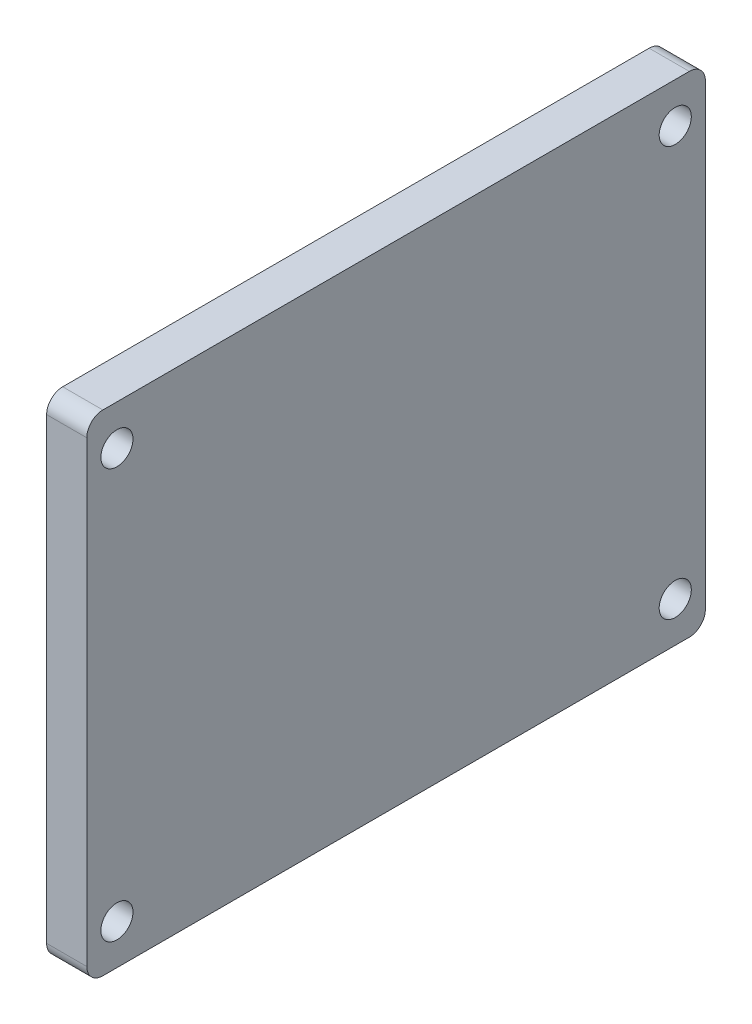
ISO-10303-21;
HEADER;
FILE_DESCRIPTION(('STEP AP214'),'2;1');
FILE_NAME('part.step','',(''),(''),'','','');
FILE_SCHEMA(('AUTOMOTIVE_DESIGN { 1 0 10303 214 1 1 1 1 }'));
ENDSEC;
DATA;
#1=APPLICATION_CONTEXT('core data for automotive mechanical design processes');
#2=APPLICATION_PROTOCOL_DEFINITION('international standard','automotive_design',2000,#1);
#3=PRODUCT_CONTEXT('',#1,'mechanical');
#4=PRODUCT('Part','Part','',(#3));
#5=PRODUCT_RELATED_PRODUCT_CATEGORY('part','',(#4));
#6=PRODUCT_DEFINITION_FORMATION('','',#4);
#7=PRODUCT_DEFINITION_CONTEXT('part definition',#1,'design');
#8=PRODUCT_DEFINITION('design','',#6,#7);
#9=PRODUCT_DEFINITION_SHAPE('','',#8);
#10=(LENGTH_UNIT() NAMED_UNIT(*) SI_UNIT(.MILLI.,.METRE.));
#11=(NAMED_UNIT(*) PLANE_ANGLE_UNIT() SI_UNIT($,.RADIAN.));
#12=(NAMED_UNIT(*) SI_UNIT($,.STERADIAN.) SOLID_ANGLE_UNIT());
#13=UNCERTAINTY_MEASURE_WITH_UNIT(LENGTH_MEASURE(1.E-05),#10,'distance_accuracy_value','');
#14=(GEOMETRIC_REPRESENTATION_CONTEXT(3) GLOBAL_UNCERTAINTY_ASSIGNED_CONTEXT((#13)) GLOBAL_UNIT_ASSIGNED_CONTEXT((#10,
#11,#12)) REPRESENTATION_CONTEXT('',''));
#15=CARTESIAN_POINT('',(0.,0.,0.));
#16=DIRECTION('',(0.,0.,1.));
#17=DIRECTION('',(1.,0.,0.));
#18=AXIS2_PLACEMENT_3D('',#15,#16,#17);
#19=CARTESIAN_POINT('',(5.,30.5,-38.5));
#20=DIRECTION('',(0.,0.,1.));
#21=DIRECTION('',(0.,-1.,0.));
#22=AXIS2_PLACEMENT_3D('',#19,#20,#21);
#23=PLANE('',#22);
#24=DIRECTION('',(0.,1.,0.));
#25=VECTOR('',#24,1.);
#26=CARTESIAN_POINT('',(5.,30.5,-38.5));
#27=LINE('',#26,#25);
#28=CARTESIAN_POINT('',(5.,-28.5,-38.5));
#29=VERTEX_POINT('',#28);
#30=CARTESIAN_POINT('',(5.,28.5,-38.5));
#31=VERTEX_POINT('',#30);
#32=EDGE_CURVE('E129',#29,#31,#27,.T.);
#33=ORIENTED_EDGE('',*,*,#32,.F.);
#34=DIRECTION('',(-1.,0.,0.));
#35=VECTOR('',#34,1.);
#36=CARTESIAN_POINT('',(5.,-28.5,-38.5));
#37=LINE('',#36,#35);
#38=CARTESIAN_POINT('',(0.,-28.5,-38.5));
#39=VERTEX_POINT('',#38);
#40=EDGE_CURVE('E11',#29,#39,#37,.T.);
#41=ORIENTED_EDGE('',*,*,#40,.T.);
#42=DIRECTION('',(0.,1.,0.));
#43=VECTOR('',#42,1.);
#44=CARTESIAN_POINT('',(0.,30.5,-38.5));
#45=LINE('',#44,#43);
#46=CARTESIAN_POINT('',(0.,28.5,-38.5));
#47=VERTEX_POINT('',#46);
#48=EDGE_CURVE('E131',#39,#47,#45,.T.);
#49=ORIENTED_EDGE('',*,*,#48,.T.);
#50=DIRECTION('',(-1.,0.,0.));
#51=VECTOR('',#50,1.);
#52=CARTESIAN_POINT('',(5.,28.5,-38.5));
#53=LINE('',#52,#51);
#54=EDGE_CURVE('E144',#47,#31,#53,.F.);
#55=ORIENTED_EDGE('',*,*,#54,.T.);
#56=EDGE_LOOP('',(#33,#41,#49,#55));
#57=FACE_BOUND('',#56,.T.);
#58=ADVANCED_FACE('F37',(#57),#23,.F.);
#59=CARTESIAN_POINT('',(5.,30.5,38.5));
#60=DIRECTION('',(0.,-1.,0.));
#61=DIRECTION('',(0.,0.,-1.));
#62=AXIS2_PLACEMENT_3D('',#59,#60,#61);
#63=PLANE('',#62);
#64=DIRECTION('',(0.,0.,1.));
#65=VECTOR('',#64,1.);
#66=CARTESIAN_POINT('',(5.,30.5,38.5));
#67=LINE('',#66,#65);
#68=CARTESIAN_POINT('',(5.,30.5,-36.5));
#69=VERTEX_POINT('',#68);
#70=CARTESIAN_POINT('',(5.,30.5,36.5));
#71=VERTEX_POINT('',#70);
#72=EDGE_CURVE('E326',#69,#71,#67,.T.);
#73=ORIENTED_EDGE('',*,*,#72,.F.);
#74=DIRECTION('',(-1.,0.,0.));
#75=VECTOR('',#74,1.);
#76=CARTESIAN_POINT('',(5.,30.5,-36.5));
#77=LINE('',#76,#75);
#78=CARTESIAN_POINT('',(0.,30.5,-36.5));
#79=VERTEX_POINT('',#78);
#80=EDGE_CURVE('E138',#69,#79,#77,.T.);
#81=ORIENTED_EDGE('',*,*,#80,.T.);
#82=DIRECTION('',(0.,0.,1.));
#83=VECTOR('',#82,1.);
#84=CARTESIAN_POINT('',(0.,30.5,38.5));
#85=LINE('',#84,#83);
#86=CARTESIAN_POINT('',(0.,30.5,36.5));
#87=VERTEX_POINT('',#86);
#88=EDGE_CURVE('E126',#79,#87,#85,.T.);
#89=ORIENTED_EDGE('',*,*,#88,.T.);
#90=DIRECTION('',(-1.,0.,0.));
#91=VECTOR('',#90,1.);
#92=CARTESIAN_POINT('',(5.,30.5,36.5));
#93=LINE('',#92,#91);
#94=EDGE_CURVE('E112',#87,#71,#93,.F.);
#95=ORIENTED_EDGE('',*,*,#94,.T.);
#96=EDGE_LOOP('',(#73,#81,#89,#95));
#97=FACE_BOUND('',#96,.T.);
#98=ADVANCED_FACE('F178',(#97),#63,.F.);
#99=CARTESIAN_POINT('',(5.,30.5,38.5));
#100=DIRECTION('',(0.,0.,-1.));
#101=DIRECTION('',(0.,1.,0.));
#102=AXIS2_PLACEMENT_3D('',#99,#100,#101);
#103=PLANE('',#102);
#104=DIRECTION('',(0.,-1.,0.));
#105=VECTOR('',#104,1.);
#106=CARTESIAN_POINT('',(0.,30.5,38.5));
#107=LINE('',#106,#105);
#108=CARTESIAN_POINT('',(0.,28.5,38.5));
#109=VERTEX_POINT('',#108);
#110=CARTESIAN_POINT('',(0.,-28.5,38.5));
#111=VERTEX_POINT('',#110);
#112=EDGE_CURVE('E118',#109,#111,#107,.T.);
#113=ORIENTED_EDGE('',*,*,#112,.T.);
#114=DIRECTION('',(-1.,0.,0.));
#115=VECTOR('',#114,1.);
#116=CARTESIAN_POINT('',(5.,-28.5,38.5));
#117=LINE('',#116,#115);
#118=CARTESIAN_POINT('',(5.,-28.5,38.5));
#119=VERTEX_POINT('',#118);
#120=EDGE_CURVE('E60',#111,#119,#117,.F.);
#121=ORIENTED_EDGE('',*,*,#120,.T.);
#122=DIRECTION('',(0.,-1.,0.));
#123=VECTOR('',#122,1.);
#124=CARTESIAN_POINT('',(5.,30.5,38.5));
#125=LINE('',#124,#123);
#126=CARTESIAN_POINT('',(5.,28.5,38.5));
#127=VERTEX_POINT('',#126);
#128=EDGE_CURVE('E119',#127,#119,#125,.T.);
#129=ORIENTED_EDGE('',*,*,#128,.F.);
#130=DIRECTION('',(-1.,0.,0.));
#131=VECTOR('',#130,1.);
#132=CARTESIAN_POINT('',(5.,28.5,38.5));
#133=LINE('',#132,#131);
#134=EDGE_CURVE('E110',#127,#109,#133,.T.);
#135=ORIENTED_EDGE('',*,*,#134,.T.);
#136=EDGE_LOOP('',(#113,#121,#129,#135));
#137=FACE_BOUND('',#136,.T.);
#138=ADVANCED_FACE('F117',(#137),#103,.F.);
#139=CARTESIAN_POINT('',(5.,-30.5,38.5));
#140=DIRECTION('',(0.,1.,0.));
#141=DIRECTION('',(0.,0.,1.));
#142=AXIS2_PLACEMENT_3D('',#139,#140,#141);
#143=PLANE('',#142);
#144=DIRECTION('',(0.,0.,-1.));
#145=VECTOR('',#144,1.);
#146=CARTESIAN_POINT('',(5.,-30.5,38.5));
#147=LINE('',#146,#145);
#148=CARTESIAN_POINT('',(5.,-30.5,36.5));
#149=VERTEX_POINT('',#148);
#150=CARTESIAN_POINT('',(5.,-30.5,-36.5));
#151=VERTEX_POINT('',#150);
#152=EDGE_CURVE('E120',#149,#151,#147,.T.);
#153=ORIENTED_EDGE('',*,*,#152,.F.);
#154=DIRECTION('',(-1.,0.,0.));
#155=VECTOR('',#154,1.);
#156=CARTESIAN_POINT('',(5.,-30.5,36.5));
#157=LINE('',#156,#155);
#158=CARTESIAN_POINT('',(0.,-30.5,36.5));
#159=VERTEX_POINT('',#158);
#160=EDGE_CURVE('E151',#149,#159,#157,.T.);
#161=ORIENTED_EDGE('',*,*,#160,.T.);
#162=DIRECTION('',(0.,0.,-1.));
#163=VECTOR('',#162,1.);
#164=CARTESIAN_POINT('',(0.,-30.5,38.5));
#165=LINE('',#164,#163);
#166=CARTESIAN_POINT('',(0.,-30.5,-36.5));
#167=VERTEX_POINT('',#166);
#168=EDGE_CURVE('E125',#159,#167,#165,.T.);
#169=ORIENTED_EDGE('',*,*,#168,.T.);
#170=DIRECTION('',(-1.,0.,0.));
#171=VECTOR('',#170,1.);
#172=CARTESIAN_POINT('',(5.,-30.5,-36.5));
#173=LINE('',#172,#171);
#174=EDGE_CURVE('E149',#167,#151,#173,.F.);
#175=ORIENTED_EDGE('',*,*,#174,.T.);
#176=EDGE_LOOP('',(#153,#161,#169,#175));
#177=FACE_BOUND('',#176,.T.);
#178=ADVANCED_FACE('F164',(#177),#143,.F.);
#179=CARTESIAN_POINT('',(5.,0.,0.));
#180=DIRECTION('',(1.,0.,0.));
#181=DIRECTION('',(0.,0.,-1.));
#182=AXIS2_PLACEMENT_3D('',#179,#180,#181);
#183=PLANE('',#182);
#184=CARTESIAN_POINT('',(5.,-25.5,34.75));
#185=DIRECTION('',(1.,0.,0.));
#186=DIRECTION('',(0.,0.,-1.));
#187=AXIS2_PLACEMENT_3D('',#184,#185,#186);
#188=CIRCLE('',#187,2.);
#189=CARTESIAN_POINT('',(5.,-25.5,32.75));
#190=VERTEX_POINT('',#189);
#191=EDGE_CURVE('E312',#190,#190,#188,.T.);
#192=ORIENTED_EDGE('',*,*,#191,.F.);
#193=EDGE_LOOP('',(#192));
#194=FACE_BOUND('',#193,.T.);
#195=CARTESIAN_POINT('',(5.,25.5,-34.75));
#196=DIRECTION('',(1.,0.,0.));
#197=DIRECTION('',(0.,0.,-1.));
#198=AXIS2_PLACEMENT_3D('',#195,#196,#197);
#199=CIRCLE('',#198,2.);
#200=CARTESIAN_POINT('',(5.,25.5,-36.75));
#201=VERTEX_POINT('',#200);
#202=EDGE_CURVE('E305',#201,#201,#199,.T.);
#203=ORIENTED_EDGE('',*,*,#202,.F.);
#204=EDGE_LOOP('',(#203));
#205=FACE_BOUND('',#204,.T.);
#206=CARTESIAN_POINT('',(5.,-25.5,-34.75));
#207=DIRECTION('',(1.,0.,0.));
#208=DIRECTION('',(0.,0.,-1.));
#209=AXIS2_PLACEMENT_3D('',#206,#207,#208);
#210=CIRCLE('',#209,2.);
#211=CARTESIAN_POINT('',(5.,-25.5,-36.75));
#212=VERTEX_POINT('',#211);
#213=EDGE_CURVE('E302',#212,#212,#210,.T.);
#214=ORIENTED_EDGE('',*,*,#213,.F.);
#215=EDGE_LOOP('',(#214));
#216=FACE_BOUND('',#215,.T.);
#217=CARTESIAN_POINT('',(5.,25.5,34.75));
#218=DIRECTION('',(1.,0.,0.));
#219=DIRECTION('',(0.,0.,-1.));
#220=AXIS2_PLACEMENT_3D('',#217,#218,#219);
#221=CIRCLE('',#220,2.);
#222=CARTESIAN_POINT('',(5.,25.5,32.75));
#223=VERTEX_POINT('',#222);
#224=EDGE_CURVE('E311',#223,#223,#221,.T.);
#225=ORIENTED_EDGE('',*,*,#224,.F.);
#226=EDGE_LOOP('',(#225));
#227=FACE_BOUND('',#226,.T.);
#228=ORIENTED_EDGE('',*,*,#128,.T.);
#229=CARTESIAN_POINT('',(5.,-28.5,36.5));
#230=DIRECTION('',(1.,0.,0.));
#231=DIRECTION('',(0.,0.,-1.));
#232=AXIS2_PLACEMENT_3D('',#229,#230,#231);
#233=CIRCLE('',#232,2.);
#234=EDGE_CURVE('E45',#119,#149,#233,.T.);
#235=ORIENTED_EDGE('',*,*,#234,.T.);
#236=ORIENTED_EDGE('',*,*,#152,.T.);
#237=CARTESIAN_POINT('',(5.,-28.5,-36.5));
#238=DIRECTION('',(1.,0.,0.));
#239=DIRECTION('',(0.,0.,-1.));
#240=AXIS2_PLACEMENT_3D('',#237,#238,#239);
#241=CIRCLE('',#240,2.);
#242=EDGE_CURVE('E52',#151,#29,#241,.T.);
#243=ORIENTED_EDGE('',*,*,#242,.T.);
#244=ORIENTED_EDGE('',*,*,#32,.T.);
#245=CARTESIAN_POINT('',(5.,28.5,-36.5));
#246=DIRECTION('',(1.,0.,0.));
#247=DIRECTION('',(0.,0.,-1.));
#248=AXIS2_PLACEMENT_3D('',#245,#246,#247);
#249=CIRCLE('',#248,2.);
#250=EDGE_CURVE('E147',#31,#69,#249,.T.);
#251=ORIENTED_EDGE('',*,*,#250,.T.);
#252=ORIENTED_EDGE('',*,*,#72,.T.);
#253=CARTESIAN_POINT('',(5.,28.5,36.5));
#254=DIRECTION('',(1.,0.,0.));
#255=DIRECTION('',(0.,0.,-1.));
#256=AXIS2_PLACEMENT_3D('',#253,#254,#255);
#257=CIRCLE('',#256,2.);
#258=EDGE_CURVE('E136',#71,#127,#257,.T.);
#259=ORIENTED_EDGE('',*,*,#258,.T.);
#260=EDGE_LOOP('',(#228,#235,#236,#243,#244,#251,#252,#259));
#261=FACE_BOUND('',#260,.T.);
#262=ADVANCED_FACE('F160',(#194,#205,#216,#227,#261),#183,.T.);
#263=CARTESIAN_POINT('',(0.,0.,0.));
#264=DIRECTION('',(1.,0.,0.));
#265=DIRECTION('',(0.,0.,-1.));
#266=AXIS2_PLACEMENT_3D('',#263,#264,#265);
#267=PLANE('',#266);
#268=CARTESIAN_POINT('',(0.,-25.5,34.75));
#269=DIRECTION('',(1.,0.,0.));
#270=DIRECTION('',(0.,0.,-1.));
#271=AXIS2_PLACEMENT_3D('',#268,#269,#270);
#272=CIRCLE('',#271,2.);
#273=CARTESIAN_POINT('',(0.,-25.5,32.75));
#274=VERTEX_POINT('',#273);
#275=EDGE_CURVE('E308',#274,#274,#272,.T.);
#276=ORIENTED_EDGE('',*,*,#275,.T.);
#277=EDGE_LOOP('',(#276));
#278=FACE_BOUND('',#277,.T.);
#279=CARTESIAN_POINT('',(0.,25.5,-34.75));
#280=DIRECTION('',(1.,0.,0.));
#281=DIRECTION('',(0.,0.,-1.));
#282=AXIS2_PLACEMENT_3D('',#279,#280,#281);
#283=CIRCLE('',#282,2.);
#284=CARTESIAN_POINT('',(0.,25.5,-36.75));
#285=VERTEX_POINT('',#284);
#286=EDGE_CURVE('E315',#285,#285,#283,.T.);
#287=ORIENTED_EDGE('',*,*,#286,.T.);
#288=EDGE_LOOP('',(#287));
#289=FACE_BOUND('',#288,.T.);
#290=CARTESIAN_POINT('',(0.,-25.5,-34.75));
#291=DIRECTION('',(1.,0.,0.));
#292=DIRECTION('',(0.,0.,-1.));
#293=AXIS2_PLACEMENT_3D('',#290,#291,#292);
#294=CIRCLE('',#293,2.);
#295=CARTESIAN_POINT('',(0.,-25.5,-36.75));
#296=VERTEX_POINT('',#295);
#297=EDGE_CURVE('E299',#296,#296,#294,.T.);
#298=ORIENTED_EDGE('',*,*,#297,.T.);
#299=EDGE_LOOP('',(#298));
#300=FACE_BOUND('',#299,.T.);
#301=CARTESIAN_POINT('',(0.,25.5,34.75));
#302=DIRECTION('',(1.,0.,0.));
#303=DIRECTION('',(0.,0.,-1.));
#304=AXIS2_PLACEMENT_3D('',#301,#302,#303);
#305=CIRCLE('',#304,2.);
#306=CARTESIAN_POINT('',(0.,25.5,32.75));
#307=VERTEX_POINT('',#306);
#308=EDGE_CURVE('E320',#307,#307,#305,.T.);
#309=ORIENTED_EDGE('',*,*,#308,.T.);
#310=EDGE_LOOP('',(#309));
#311=FACE_BOUND('',#310,.T.);
#312=ORIENTED_EDGE('',*,*,#168,.F.);
#313=CARTESIAN_POINT('',(0.,-28.5,36.5));
#314=DIRECTION('',(1.,0.,0.));
#315=DIRECTION('',(0.,0.,-1.));
#316=AXIS2_PLACEMENT_3D('',#313,#314,#315);
#317=CIRCLE('',#316,2.);
#318=EDGE_CURVE('E124',#159,#111,#317,.F.);
#319=ORIENTED_EDGE('',*,*,#318,.T.);
#320=ORIENTED_EDGE('',*,*,#112,.F.);
#321=CARTESIAN_POINT('',(0.,28.5,36.5));
#322=DIRECTION('',(1.,0.,0.));
#323=DIRECTION('',(0.,0.,-1.));
#324=AXIS2_PLACEMENT_3D('',#321,#322,#323);
#325=CIRCLE('',#324,2.);
#326=EDGE_CURVE('E106',#109,#87,#325,.F.);
#327=ORIENTED_EDGE('',*,*,#326,.T.);
#328=ORIENTED_EDGE('',*,*,#88,.F.);
#329=CARTESIAN_POINT('',(0.,28.5,-36.5));
#330=DIRECTION('',(1.,0.,0.));
#331=DIRECTION('',(0.,0.,-1.));
#332=AXIS2_PLACEMENT_3D('',#329,#330,#331);
#333=CIRCLE('',#332,2.);
#334=EDGE_CURVE('E141',#79,#47,#333,.F.);
#335=ORIENTED_EDGE('',*,*,#334,.T.);
#336=ORIENTED_EDGE('',*,*,#48,.F.);
#337=CARTESIAN_POINT('',(0.,-28.5,-36.5));
#338=DIRECTION('',(1.,0.,0.));
#339=DIRECTION('',(0.,0.,-1.));
#340=AXIS2_PLACEMENT_3D('',#337,#338,#339);
#341=CIRCLE('',#340,2.);
#342=EDGE_CURVE('E154',#39,#167,#341,.F.);
#343=ORIENTED_EDGE('',*,*,#342,.T.);
#344=EDGE_LOOP('',(#312,#319,#320,#327,#328,#335,#336,#343));
#345=FACE_BOUND('',#344,.T.);
#346=ADVANCED_FACE('F123',(#278,#289,#300,#311,#345),#267,.F.);
#347=CARTESIAN_POINT('',(0.,25.5,34.75));
#348=DIRECTION('',(1.,0.,0.));
#349=DIRECTION('',(0.,0.,-1.));
#350=AXIS2_PLACEMENT_3D('',#347,#348,#349);
#351=CYLINDRICAL_SURFACE('',#350,2.);
#352=ORIENTED_EDGE('',*,*,#308,.F.);
#353=EDGE_LOOP('',(#352));
#354=FACE_BOUND('',#353,.T.);
#355=ORIENTED_EDGE('',*,*,#224,.T.);
#356=EDGE_LOOP('',(#355));
#357=FACE_BOUND('',#356,.T.);
#358=ADVANCED_FACE('F206',(#354,#357),#351,.F.);
#359=CARTESIAN_POINT('',(0.,-25.5,-34.75));
#360=DIRECTION('',(1.,0.,0.));
#361=DIRECTION('',(0.,0.,-1.));
#362=AXIS2_PLACEMENT_3D('',#359,#360,#361);
#363=CYLINDRICAL_SURFACE('',#362,2.);
#364=ORIENTED_EDGE('',*,*,#297,.F.);
#365=EDGE_LOOP('',(#364));
#366=FACE_BOUND('',#365,.T.);
#367=ORIENTED_EDGE('',*,*,#213,.T.);
#368=EDGE_LOOP('',(#367));
#369=FACE_BOUND('',#368,.T.);
#370=ADVANCED_FACE('F199',(#366,#369),#363,.F.);
#371=CARTESIAN_POINT('',(0.,25.5,-34.75));
#372=DIRECTION('',(1.,0.,0.));
#373=DIRECTION('',(0.,0.,-1.));
#374=AXIS2_PLACEMENT_3D('',#371,#372,#373);
#375=CYLINDRICAL_SURFACE('',#374,2.);
#376=ORIENTED_EDGE('',*,*,#286,.F.);
#377=EDGE_LOOP('',(#376));
#378=FACE_BOUND('',#377,.T.);
#379=ORIENTED_EDGE('',*,*,#202,.T.);
#380=EDGE_LOOP('',(#379));
#381=FACE_BOUND('',#380,.T.);
#382=ADVANCED_FACE('F193',(#378,#381),#375,.F.);
#383=CARTESIAN_POINT('',(0.,-25.5,34.75));
#384=DIRECTION('',(1.,0.,0.));
#385=DIRECTION('',(0.,0.,-1.));
#386=AXIS2_PLACEMENT_3D('',#383,#384,#385);
#387=CYLINDRICAL_SURFACE('',#386,2.);
#388=ORIENTED_EDGE('',*,*,#275,.F.);
#389=EDGE_LOOP('',(#388));
#390=FACE_BOUND('',#389,.T.);
#391=ORIENTED_EDGE('',*,*,#191,.T.);
#392=EDGE_LOOP('',(#391));
#393=FACE_BOUND('',#392,.T.);
#394=ADVANCED_FACE('F189',(#390,#393),#387,.F.);
#395=CARTESIAN_POINT('',(5.,28.5,36.5));
#396=DIRECTION('',(-1.,0.,0.));
#397=DIRECTION('',(0.,0.,1.));
#398=AXIS2_PLACEMENT_3D('',#395,#396,#397);
#399=CYLINDRICAL_SURFACE('',#398,2.);
#400=ORIENTED_EDGE('',*,*,#258,.F.);
#401=ORIENTED_EDGE('',*,*,#94,.F.);
#402=ORIENTED_EDGE('',*,*,#326,.F.);
#403=ORIENTED_EDGE('',*,*,#134,.F.);
#404=EDGE_LOOP('',(#400,#401,#402,#403));
#405=FACE_BOUND('',#404,.T.);
#406=ADVANCED_FACE('F109',(#405),#399,.T.);
#407=CARTESIAN_POINT('',(5.,28.5,-36.5));
#408=DIRECTION('',(-1.,0.,0.));
#409=DIRECTION('',(0.,0.,1.));
#410=AXIS2_PLACEMENT_3D('',#407,#408,#409);
#411=CYLINDRICAL_SURFACE('',#410,2.);
#412=ORIENTED_EDGE('',*,*,#250,.F.);
#413=ORIENTED_EDGE('',*,*,#54,.F.);
#414=ORIENTED_EDGE('',*,*,#334,.F.);
#415=ORIENTED_EDGE('',*,*,#80,.F.);
#416=EDGE_LOOP('',(#412,#413,#414,#415));
#417=FACE_BOUND('',#416,.T.);
#418=ADVANCED_FACE('F169',(#417),#411,.T.);
#419=CARTESIAN_POINT('',(5.,-28.5,36.5));
#420=DIRECTION('',(-1.,0.,0.));
#421=DIRECTION('',(0.,0.,1.));
#422=AXIS2_PLACEMENT_3D('',#419,#420,#421);
#423=CYLINDRICAL_SURFACE('',#422,2.);
#424=ORIENTED_EDGE('',*,*,#234,.F.);
#425=ORIENTED_EDGE('',*,*,#120,.F.);
#426=ORIENTED_EDGE('',*,*,#318,.F.);
#427=ORIENTED_EDGE('',*,*,#160,.F.);
#428=EDGE_LOOP('',(#424,#425,#426,#427));
#429=FACE_BOUND('',#428,.T.);
#430=ADVANCED_FACE('F167',(#429),#423,.T.);
#431=CARTESIAN_POINT('',(5.,-28.5,-36.5));
#432=DIRECTION('',(-1.,0.,0.));
#433=DIRECTION('',(0.,0.,1.));
#434=AXIS2_PLACEMENT_3D('',#431,#432,#433);
#435=CYLINDRICAL_SURFACE('',#434,2.);
#436=ORIENTED_EDGE('',*,*,#242,.F.);
#437=ORIENTED_EDGE('',*,*,#174,.F.);
#438=ORIENTED_EDGE('',*,*,#342,.F.);
#439=ORIENTED_EDGE('',*,*,#40,.F.);
#440=EDGE_LOOP('',(#436,#437,#438,#439));
#441=FACE_BOUND('',#440,.T.);
#442=ADVANCED_FACE('F39',(#441),#435,.T.);
#443=CLOSED_SHELL('',(#58,#98,#138,#178,#262,#346,#358,#370,#382,#394,#406,#418,#430,#442));
#444=MANIFOLD_SOLID_BREP('B2',#443);
#445=ADVANCED_BREP_SHAPE_REPRESENTATION('',(#18,#444),#14);
#446=SHAPE_DEFINITION_REPRESENTATION(#9,#445);
ENDSEC;
END-ISO-10303-21;
